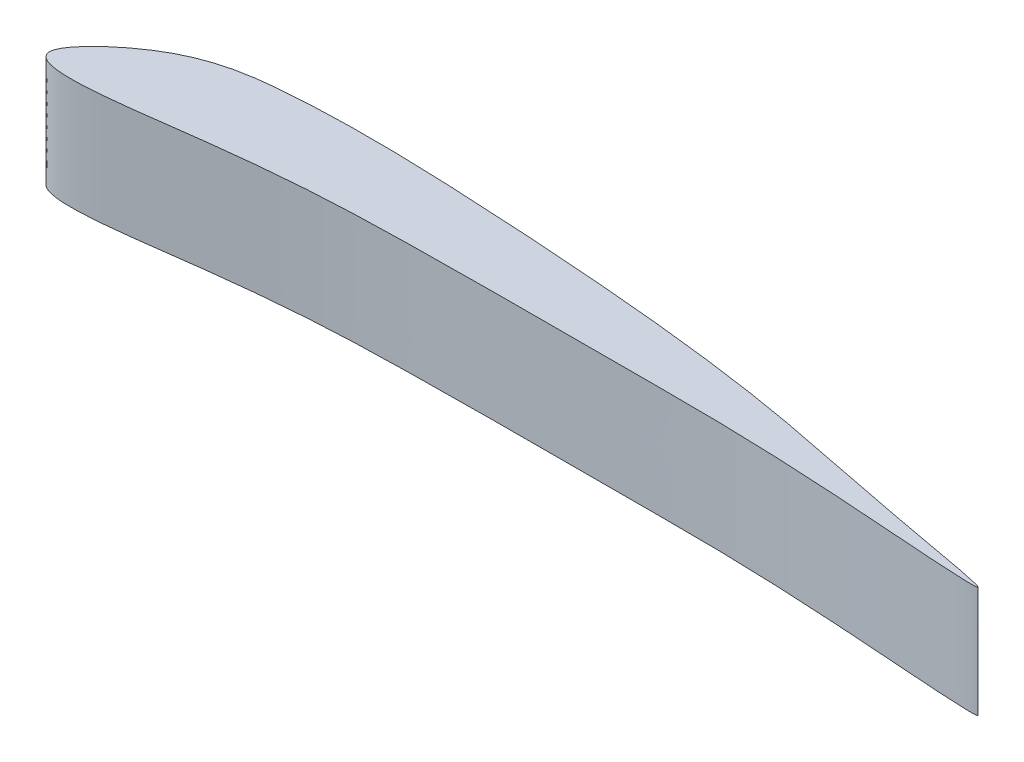
ISO-10303-21;
HEADER;
FILE_DESCRIPTION(('STEP AP214'),'2;1');
FILE_NAME('part.step','',(''),(''),'','','');
FILE_SCHEMA(('AUTOMOTIVE_DESIGN { 1 0 10303 214 1 1 1 1 }'));
ENDSEC;
DATA;
#1=APPLICATION_CONTEXT('core data for automotive mechanical design processes');
#2=APPLICATION_PROTOCOL_DEFINITION('international standard','automotive_design',2000,#1);
#3=PRODUCT_CONTEXT('',#1,'mechanical');
#4=PRODUCT('Part','Part','',(#3));
#5=PRODUCT_RELATED_PRODUCT_CATEGORY('part','',(#4));
#6=PRODUCT_DEFINITION_FORMATION('','',#4);
#7=PRODUCT_DEFINITION_CONTEXT('part definition',#1,'design');
#8=PRODUCT_DEFINITION('design','',#6,#7);
#9=PRODUCT_DEFINITION_SHAPE('','',#8);
#10=(LENGTH_UNIT() NAMED_UNIT(*) SI_UNIT(.MILLI.,.METRE.));
#11=(NAMED_UNIT(*) PLANE_ANGLE_UNIT() SI_UNIT($,.RADIAN.));
#12=(NAMED_UNIT(*) SI_UNIT($,.STERADIAN.) SOLID_ANGLE_UNIT());
#13=UNCERTAINTY_MEASURE_WITH_UNIT(LENGTH_MEASURE(1.E-05),#10,'distance_accuracy_value','');
#14=(GEOMETRIC_REPRESENTATION_CONTEXT(3) GLOBAL_UNCERTAINTY_ASSIGNED_CONTEXT((#13)) GLOBAL_UNIT_ASSIGNED_CONTEXT((#10,
#11,#12)) REPRESENTATION_CONTEXT('',''));
#15=CARTESIAN_POINT('',(0.,0.,0.));
#16=DIRECTION('',(0.,0.,1.));
#17=DIRECTION('',(1.,0.,0.));
#18=AXIS2_PLACEMENT_3D('',#15,#16,#17);
#19=CARTESIAN_POINT('',(100.,12.,0.));
#20=CARTESIAN_POINT('',(99.3452319174061,12.,-0.276820732514674));
#21=CARTESIAN_POINT('',(85.2626270491777,12.,-2.69927942556848));
#22=CARTESIAN_POINT('',(68.7391725968095,12.,-6.55799620708569));
#23=CARTESIAN_POINT('',(41.8732199624331,12.,-8.72436904606566));
#24=CARTESIAN_POINT('',(19.4434830231851,12.,-9.48116398196593));
#25=CARTESIAN_POINT('',(6.80706732958971,12.,-7.64824681048201));
#26=CARTESIAN_POINT('',(-4.76740027921103,12.,3.26415470359221));
#27=CARTESIAN_POINT('',(20.110659343629,12.,-0.607873234510861));
#28=CARTESIAN_POINT('',(35.1172806974007,12.,-1.44131152124689));
#29=CARTESIAN_POINT('',(62.8658032171912,12.,-1.35230567791118));
#30=CARTESIAN_POINT('',(77.46055958642,12.,-1.48480367483859));
#31=CARTESIAN_POINT('',(101.122990871788,12.,0.474774449151869));
#32=CARTESIAN_POINT('',(100.,12.,0.));
#33=B_SPLINE_CURVE_WITH_KNOTS('',3,(#19,#20,#21,#22,#23,#24,#25,#26,#27,#28,#29,#30,#31,#32),
.UNSPECIFIED.,.T.,.F.,(4,1,1,1,1,1,1,1,1,1,1,4),(0.,0.0403228964718751,0.143748371845612,
0.307747436705292,0.413694397618139,0.470412693037584,0.508330629797932,0.57861537664988,
0.681874535484877,0.809073770543814,0.930842315217024,1.),.UNSPECIFIED.);
#34=DIRECTION('',(0.,-1.,0.));
#35=VECTOR('',#34,1.);
#36=SURFACE_OF_LINEAR_EXTRUSION('',#33,#35);
#37=CARTESIAN_POINT('',(100.,12.,0.));
#38=VERTEX_POINT('',#37);
#39=EDGE_CURVE('E10',#38,#38,#33,.T.);
#40=ORIENTED_EDGE('',*,*,#39,.F.);
#41=EDGE_LOOP('',(#40));
#42=FACE_BOUND('',#41,.T.);
#43=CARTESIAN_POINT('',(100.,0.,0.));
#44=CARTESIAN_POINT('',(99.3452319174061,0.,-0.276820732514674));
#45=CARTESIAN_POINT('',(85.2626270491777,0.,-2.69927942556848));
#46=CARTESIAN_POINT('',(68.7391725968095,0.,-6.55799620708569));
#47=CARTESIAN_POINT('',(41.8732199624331,0.,-8.72436904606566));
#48=CARTESIAN_POINT('',(19.4434830231851,0.,-9.48116398196593));
#49=CARTESIAN_POINT('',(6.80706732958971,0.,-7.64824681048201));
#50=CARTESIAN_POINT('',(-4.76740027921103,0.,3.26415470359221));
#51=CARTESIAN_POINT('',(20.110659343629,0.,-0.607873234510861));
#52=CARTESIAN_POINT('',(35.1172806974007,0.,-1.44131152124689));
#53=CARTESIAN_POINT('',(62.8658032171912,0.,-1.35230567791118));
#54=CARTESIAN_POINT('',(77.46055958642,0.,-1.48480367483859));
#55=CARTESIAN_POINT('',(101.122990871788,0.,0.474774449151869));
#56=CARTESIAN_POINT('',(100.,0.,0.));
#57=B_SPLINE_CURVE_WITH_KNOTS('',3,(#43,#44,#45,#46,#47,#48,#49,#50,#51,#52,#53,#54,#55,#56),
.UNSPECIFIED.,.T.,.F.,(4,1,1,1,1,1,1,1,1,1,1,4),(0.,0.0403228964718751,0.143748371845612,
0.307747436705292,0.413694397618139,0.470412693037584,0.508330629797932,0.57861537664988,
0.681874535484877,0.809073770543814,0.930842315217024,1.),.UNSPECIFIED.);
#58=CARTESIAN_POINT('',(100.,0.,0.));
#59=VERTEX_POINT('',#58);
#60=EDGE_CURVE('E41',#59,#59,#57,.T.);
#61=ORIENTED_EDGE('',*,*,#60,.T.);
#62=EDGE_LOOP('',(#61));
#63=FACE_BOUND('',#62,.T.);
#64=ADVANCED_FACE('F37',(#42,#63),#36,.F.);
#65=CARTESIAN_POINT('',(0.442748888953068,12.,-1.05524455972618));
#66=DIRECTION('',(0.,-1.,0.));
#67=DIRECTION('',(0.,0.,-1.));
#68=AXIS2_PLACEMENT_3D('',#65,#66,#67);
#69=PLANE('',#68);
#70=ORIENTED_EDGE('',*,*,#39,.T.);
#71=EDGE_LOOP('',(#70));
#72=FACE_BOUND('',#71,.T.);
#73=ADVANCED_FACE('F62',(#72),#69,.F.);
#74=CARTESIAN_POINT('',(0.442748888953068,0.,-1.05524455972618));
#75=DIRECTION('',(0.,-1.,0.));
#76=DIRECTION('',(0.,0.,-1.));
#77=AXIS2_PLACEMENT_3D('',#74,#75,#76);
#78=PLANE('',#77);
#79=ORIENTED_EDGE('',*,*,#60,.F.);
#80=EDGE_LOOP('',(#79));
#81=FACE_BOUND('',#80,.T.);
#82=ADVANCED_FACE('F60',(#81),#78,.T.);
#83=CLOSED_SHELL('',(#64,#73,#82));
#84=MANIFOLD_SOLID_BREP('B2',#83);
#85=ADVANCED_BREP_SHAPE_REPRESENTATION('',(#18,#84),#14);
#86=SHAPE_DEFINITION_REPRESENTATION(#9,#85);
ENDSEC;
END-ISO-10303-21;
